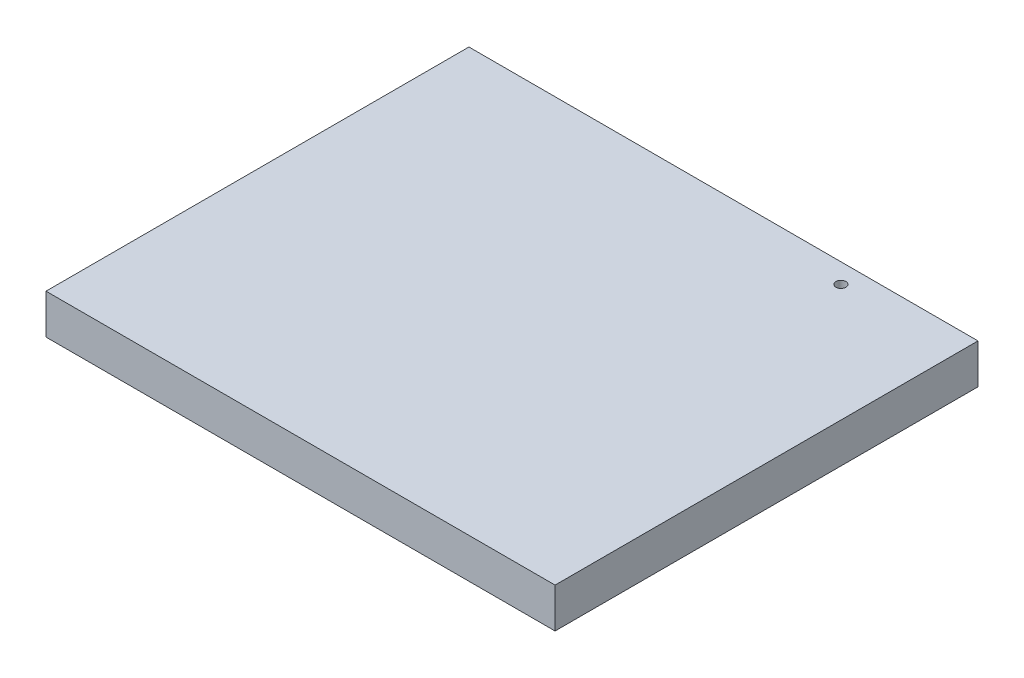
ISO-10303-21;
HEADER;
FILE_DESCRIPTION(('STEP AP214'),'2;1');
FILE_NAME('part.step','',(''),(''),'','','');
FILE_SCHEMA(('AUTOMOTIVE_DESIGN { 1 0 10303 214 1 1 1 1 }'));
ENDSEC;
DATA;
#1=APPLICATION_CONTEXT('core data for automotive mechanical design processes');
#2=APPLICATION_PROTOCOL_DEFINITION('international standard','automotive_design',2000,#1);
#3=PRODUCT_CONTEXT('',#1,'mechanical');
#4=PRODUCT('Part','Part','',(#3));
#5=PRODUCT_RELATED_PRODUCT_CATEGORY('part','',(#4));
#6=PRODUCT_DEFINITION_FORMATION('','',#4);
#7=PRODUCT_DEFINITION_CONTEXT('part definition',#1,'design');
#8=PRODUCT_DEFINITION('design','',#6,#7);
#9=PRODUCT_DEFINITION_SHAPE('','',#8);
#10=(LENGTH_UNIT() NAMED_UNIT(*) SI_UNIT(.MILLI.,.METRE.));
#11=(NAMED_UNIT(*) PLANE_ANGLE_UNIT() SI_UNIT($,.RADIAN.));
#12=(NAMED_UNIT(*) SI_UNIT($,.STERADIAN.) SOLID_ANGLE_UNIT());
#13=UNCERTAINTY_MEASURE_WITH_UNIT(LENGTH_MEASURE(1.E-05),#10,'distance_accuracy_value','');
#14=(GEOMETRIC_REPRESENTATION_CONTEXT(3) GLOBAL_UNCERTAINTY_ASSIGNED_CONTEXT((#13)) GLOBAL_UNIT_ASSIGNED_CONTEXT((#10,
#11,#12)) REPRESENTATION_CONTEXT('',''));
#15=CARTESIAN_POINT('',(0.,0.,0.));
#16=DIRECTION('',(0.,0.,1.));
#17=DIRECTION('',(1.,0.,0.));
#18=AXIS2_PLACEMENT_3D('',#15,#16,#17);
#19=CARTESIAN_POINT('',(-145.794398743962,25.4,-109.8836222286));
#20=DIRECTION('',(1.,0.,0.));
#21=DIRECTION('',(0.,0.,-1.));
#22=AXIS2_PLACEMENT_3D('',#19,#20,#21);
#23=PLANE('',#22);
#24=DIRECTION('',(0.,0.,1.));
#25=VECTOR('',#24,1.);
#26=CARTESIAN_POINT('',(-145.794398743962,0.,-109.8836222286));
#27=LINE('',#26,#25);
#28=CARTESIAN_POINT('',(-145.794398743962,0.,-109.8836222286));
#29=VERTEX_POINT('',#28);
#30=CARTESIAN_POINT('',(-145.794398743962,0.,160.1163777714));
#31=VERTEX_POINT('',#30);
#32=EDGE_CURVE('E96',#29,#31,#27,.T.);
#33=ORIENTED_EDGE('',*,*,#32,.T.);
#34=DIRECTION('',(0.,-1.,0.));
#35=VECTOR('',#34,1.);
#36=CARTESIAN_POINT('',(-145.794398743962,25.4,160.1163777714));
#37=LINE('',#36,#35);
#38=CARTESIAN_POINT('',(-145.794398743962,25.4,160.1163777714));
#39=VERTEX_POINT('',#38);
#40=EDGE_CURVE('E11',#39,#31,#37,.T.);
#41=ORIENTED_EDGE('',*,*,#40,.F.);
#42=DIRECTION('',(0.,0.,1.));
#43=VECTOR('',#42,1.);
#44=CARTESIAN_POINT('',(-145.794398743962,25.4,-109.8836222286));
#45=LINE('',#44,#43);
#46=CARTESIAN_POINT('',(-145.794398743962,25.4,-109.8836222286));
#47=VERTEX_POINT('',#46);
#48=EDGE_CURVE('E84',#47,#39,#45,.T.);
#49=ORIENTED_EDGE('',*,*,#48,.F.);
#50=DIRECTION('',(0.,-1.,0.));
#51=VECTOR('',#50,1.);
#52=CARTESIAN_POINT('',(-145.794398743962,25.4,-109.8836222286));
#53=LINE('',#52,#51);
#54=EDGE_CURVE('E92',#47,#29,#53,.T.);
#55=ORIENTED_EDGE('',*,*,#54,.T.);
#56=EDGE_LOOP('',(#33,#41,#49,#55));
#57=FACE_BOUND('',#56,.T.);
#58=ADVANCED_FACE('F33',(#57),#23,.F.);
#59=CARTESIAN_POINT('',(-145.794398743962,25.4,160.1163777714));
#60=DIRECTION('',(0.,0.,-1.));
#61=DIRECTION('',(-1.,0.,0.));
#62=AXIS2_PLACEMENT_3D('',#59,#60,#61);
#63=PLANE('',#62);
#64=DIRECTION('',(1.,0.,0.));
#65=VECTOR('',#64,1.);
#66=CARTESIAN_POINT('',(-145.794398743962,0.,160.1163777714));
#67=LINE('',#66,#65);
#68=CARTESIAN_POINT('',(179.205601256039,0.,160.1163777714));
#69=VERTEX_POINT('',#68);
#70=EDGE_CURVE('E88',#31,#69,#67,.T.);
#71=ORIENTED_EDGE('',*,*,#70,.T.);
#72=DIRECTION('',(0.,-1.,0.));
#73=VECTOR('',#72,1.);
#74=CARTESIAN_POINT('',(179.205601256039,25.4,160.1163777714));
#75=LINE('',#74,#73);
#76=CARTESIAN_POINT('',(179.205601256039,25.4,160.1163777714));
#77=VERTEX_POINT('',#76);
#78=EDGE_CURVE('E41',#77,#69,#75,.T.);
#79=ORIENTED_EDGE('',*,*,#78,.F.);
#80=DIRECTION('',(1.,0.,0.));
#81=VECTOR('',#80,1.);
#82=CARTESIAN_POINT('',(-145.794398743962,25.4,160.1163777714));
#83=LINE('',#82,#81);
#84=EDGE_CURVE('E79',#39,#77,#83,.T.);
#85=ORIENTED_EDGE('',*,*,#84,.F.);
#86=ORIENTED_EDGE('',*,*,#40,.T.);
#87=EDGE_LOOP('',(#71,#79,#85,#86));
#88=FACE_BOUND('',#87,.T.);
#89=ADVANCED_FACE('F87',(#88),#63,.F.);
#90=CARTESIAN_POINT('',(179.205601256039,25.4,-109.8836222286));
#91=DIRECTION('',(-1.,0.,0.));
#92=DIRECTION('',(0.,0.,1.));
#93=AXIS2_PLACEMENT_3D('',#90,#91,#92);
#94=PLANE('',#93);
#95=DIRECTION('',(0.,0.,-1.));
#96=VECTOR('',#95,1.);
#97=CARTESIAN_POINT('',(179.205601256039,0.,-109.8836222286));
#98=LINE('',#97,#96);
#99=CARTESIAN_POINT('',(179.205601256039,0.,-109.8836222286));
#100=VERTEX_POINT('',#99);
#101=EDGE_CURVE('E66',#69,#100,#98,.T.);
#102=ORIENTED_EDGE('',*,*,#101,.T.);
#103=DIRECTION('',(0.,-1.,0.));
#104=VECTOR('',#103,1.);
#105=CARTESIAN_POINT('',(179.205601256039,25.4,-109.8836222286));
#106=LINE('',#105,#104);
#107=CARTESIAN_POINT('',(179.205601256039,25.4,-109.8836222286));
#108=VERTEX_POINT('',#107);
#109=EDGE_CURVE('E89',#108,#100,#106,.T.);
#110=ORIENTED_EDGE('',*,*,#109,.F.);
#111=DIRECTION('',(0.,0.,-1.));
#112=VECTOR('',#111,1.);
#113=CARTESIAN_POINT('',(179.205601256039,25.4,-109.8836222286));
#114=LINE('',#113,#112);
#115=EDGE_CURVE('E82',#77,#108,#114,.T.);
#116=ORIENTED_EDGE('',*,*,#115,.F.);
#117=ORIENTED_EDGE('',*,*,#78,.T.);
#118=EDGE_LOOP('',(#102,#110,#116,#117));
#119=FACE_BOUND('',#118,.T.);
#120=ADVANCED_FACE('F90',(#119),#94,.F.);
#121=CARTESIAN_POINT('',(-145.794398743962,25.4,-109.8836222286));
#122=DIRECTION('',(0.,0.,1.));
#123=DIRECTION('',(1.,0.,0.));
#124=AXIS2_PLACEMENT_3D('',#121,#122,#123);
#125=PLANE('',#124);
#126=DIRECTION('',(-1.,0.,0.));
#127=VECTOR('',#126,1.);
#128=CARTESIAN_POINT('',(-145.794398743962,0.,-109.8836222286));
#129=LINE('',#128,#127);
#130=EDGE_CURVE('E72',#100,#29,#129,.T.);
#131=ORIENTED_EDGE('',*,*,#130,.T.);
#132=ORIENTED_EDGE('',*,*,#54,.F.);
#133=DIRECTION('',(-1.,0.,0.));
#134=VECTOR('',#133,1.);
#135=CARTESIAN_POINT('',(-145.794398743962,25.4,-109.8836222286));
#136=LINE('',#135,#134);
#137=EDGE_CURVE('E49',#108,#47,#136,.T.);
#138=ORIENTED_EDGE('',*,*,#137,.F.);
#139=ORIENTED_EDGE('',*,*,#109,.T.);
#140=EDGE_LOOP('',(#131,#132,#138,#139));
#141=FACE_BOUND('',#140,.T.);
#142=ADVANCED_FACE('F104',(#141),#125,.F.);
#143=CARTESIAN_POINT('',(0.,25.4,0.));
#144=DIRECTION('',(0.,1.,0.));
#145=DIRECTION('',(0.,0.,1.));
#146=AXIS2_PLACEMENT_3D('',#143,#144,#145);
#147=PLANE('',#146);
#148=CARTESIAN_POINT('',(104.205601256039,25.4,-97.3836222286004));
#149=DIRECTION('',(0.,1.,0.));
#150=DIRECTION('',(0.,0.,1.));
#151=AXIS2_PLACEMENT_3D('',#148,#149,#150);
#152=CIRCLE('',#151,3.19999999999999);
#153=CARTESIAN_POINT('',(104.205601256039,25.4,-94.1836222286004));
#154=VERTEX_POINT('',#153);
#155=EDGE_CURVE('E110',#154,#154,#152,.T.);
#156=ORIENTED_EDGE('',*,*,#155,.F.);
#157=EDGE_LOOP('',(#156));
#158=FACE_BOUND('',#157,.T.);
#159=ORIENTED_EDGE('',*,*,#48,.T.);
#160=ORIENTED_EDGE('',*,*,#84,.T.);
#161=ORIENTED_EDGE('',*,*,#115,.T.);
#162=ORIENTED_EDGE('',*,*,#137,.T.);
#163=EDGE_LOOP('',(#159,#160,#161,#162));
#164=FACE_BOUND('',#163,.T.);
#165=ADVANCED_FACE('F80',(#158,#164),#147,.T.);
#166=CARTESIAN_POINT('',(0.,0.,0.));
#167=DIRECTION('',(0.,1.,0.));
#168=DIRECTION('',(0.,0.,1.));
#169=AXIS2_PLACEMENT_3D('',#166,#167,#168);
#170=PLANE('',#169);
#171=CARTESIAN_POINT('',(104.205601256039,0.,-97.3836222286004));
#172=DIRECTION('',(0.,1.,0.));
#173=DIRECTION('',(0.,0.,1.));
#174=AXIS2_PLACEMENT_3D('',#171,#172,#173);
#175=CIRCLE('',#174,3.19999999999999);
#176=CARTESIAN_POINT('',(104.205601256039,0.,-94.1836222286004));
#177=VERTEX_POINT('',#176);
#178=EDGE_CURVE('E99',#177,#177,#175,.T.);
#179=ORIENTED_EDGE('',*,*,#178,.T.);
#180=EDGE_LOOP('',(#179));
#181=FACE_BOUND('',#180,.T.);
#182=ORIENTED_EDGE('',*,*,#32,.F.);
#183=ORIENTED_EDGE('',*,*,#130,.F.);
#184=ORIENTED_EDGE('',*,*,#101,.F.);
#185=ORIENTED_EDGE('',*,*,#70,.F.);
#186=EDGE_LOOP('',(#182,#183,#184,#185));
#187=FACE_BOUND('',#186,.T.);
#188=ADVANCED_FACE('F107',(#181,#187),#170,.F.);
#189=CARTESIAN_POINT('',(104.205601256039,0.,-97.3836222286004));
#190=DIRECTION('',(0.,1.,0.));
#191=DIRECTION('',(0.,0.,1.));
#192=AXIS2_PLACEMENT_3D('',#189,#190,#191);
#193=CYLINDRICAL_SURFACE('',#192,3.19999999999999);
#194=ORIENTED_EDGE('',*,*,#178,.F.);
#195=EDGE_LOOP('',(#194));
#196=FACE_BOUND('',#195,.T.);
#197=ORIENTED_EDGE('',*,*,#155,.T.);
#198=EDGE_LOOP('',(#197));
#199=FACE_BOUND('',#198,.T.);
#200=ADVANCED_FACE('F117',(#196,#199),#193,.F.);
#201=CLOSED_SHELL('',(#58,#89,#120,#142,#165,#188,#200));
#202=MANIFOLD_SOLID_BREP('B2',#201);
#203=ADVANCED_BREP_SHAPE_REPRESENTATION('',(#18,#202),#14);
#204=SHAPE_DEFINITION_REPRESENTATION(#9,#203);
ENDSEC;
END-ISO-10303-21;
